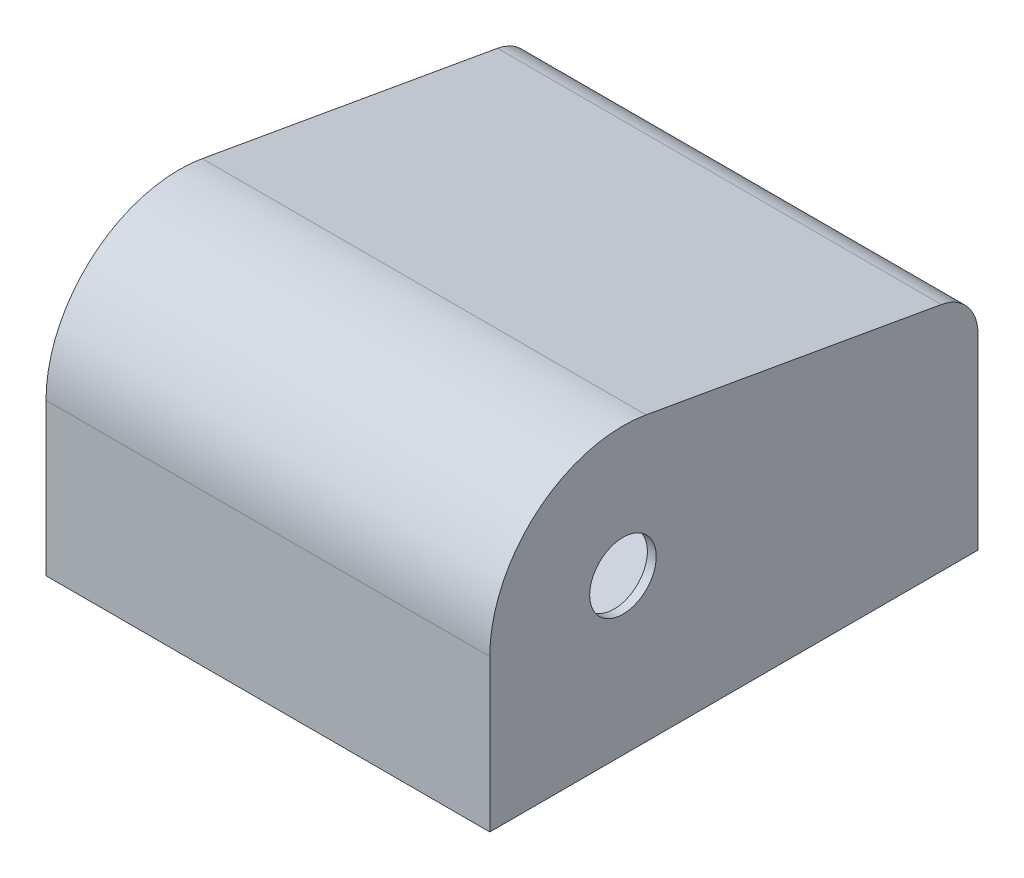
ISO-10303-21;
HEADER;
FILE_DESCRIPTION(('STEP AP214'),'2;1');
FILE_NAME('part.step','',(''),(''),'','','');
FILE_SCHEMA(('AUTOMOTIVE_DESIGN { 1 0 10303 214 1 1 1 1 }'));
ENDSEC;
DATA;
#1=APPLICATION_CONTEXT('core data for automotive mechanical design processes');
#2=APPLICATION_PROTOCOL_DEFINITION('international standard','automotive_design',2000,#1);
#3=PRODUCT_CONTEXT('',#1,'mechanical');
#4=PRODUCT('Part','Part','',(#3));
#5=PRODUCT_RELATED_PRODUCT_CATEGORY('part','',(#4));
#6=PRODUCT_DEFINITION_FORMATION('','',#4);
#7=PRODUCT_DEFINITION_CONTEXT('part definition',#1,'design');
#8=PRODUCT_DEFINITION('design','',#6,#7);
#9=PRODUCT_DEFINITION_SHAPE('','',#8);
#10=(LENGTH_UNIT() NAMED_UNIT(*) SI_UNIT(.MILLI.,.METRE.));
#11=(NAMED_UNIT(*) PLANE_ANGLE_UNIT() SI_UNIT($,.RADIAN.));
#12=(NAMED_UNIT(*) SI_UNIT($,.STERADIAN.) SOLID_ANGLE_UNIT());
#13=UNCERTAINTY_MEASURE_WITH_UNIT(LENGTH_MEASURE(1.E-05),#10,'distance_accuracy_value','');
#14=(GEOMETRIC_REPRESENTATION_CONTEXT(3) GLOBAL_UNCERTAINTY_ASSIGNED_CONTEXT((#13)) GLOBAL_UNIT_ASSIGNED_CONTEXT((#10,
#11,#12)) REPRESENTATION_CONTEXT('',''));
#15=CARTESIAN_POINT('',(0.,0.,0.));
#16=DIRECTION('',(0.,0.,1.));
#17=DIRECTION('',(1.,0.,0.));
#18=AXIS2_PLACEMENT_3D('',#15,#16,#17);
#19=CARTESIAN_POINT('',(980.,0.,0.));
#20=DIRECTION('',(-1.,0.,0.));
#21=DIRECTION('',(0.,0.,1.));
#22=AXIS2_PLACEMENT_3D('',#19,#20,#21);
#23=PLANE('',#22);
#24=DIRECTION('',(0.,1.,0.));
#25=VECTOR('',#24,1.);
#26=CARTESIAN_POINT('',(980.,0.,-1080.));
#27=LINE('',#26,#25);
#28=CARTESIAN_POINT('',(980.,20.,-1080.));
#29=VERTEX_POINT('',#28);
#30=CARTESIAN_POINT('',(980.,422.13035810296,-1080.));
#31=VERTEX_POINT('',#30);
#32=EDGE_CURVE('E197',#29,#31,#27,.T.);
#33=ORIENTED_EDGE('',*,*,#32,.F.);
#34=DIRECTION('',(0.,0.,-1.));
#35=VECTOR('',#34,1.);
#36=CARTESIAN_POINT('',(980.,20.,0.));
#37=LINE('',#36,#35);
#38=CARTESIAN_POINT('',(980.,20.,-20.));
#39=VERTEX_POINT('',#38);
#40=EDGE_CURVE('E187',#39,#29,#37,.T.);
#41=ORIENTED_EDGE('',*,*,#40,.F.);
#42=DIRECTION('',(0.,-1.,0.));
#43=VECTOR('',#42,1.);
#44=CARTESIAN_POINT('',(980.,0.,-20.));
#45=LINE('',#44,#43);
#46=CARTESIAN_POINT('',(980.,342.473922221737,-20.));
#47=VERTEX_POINT('',#46);
#48=EDGE_CURVE('E189',#47,#39,#45,.T.);
#49=ORIENTED_EDGE('',*,*,#48,.F.);
#50=CARTESIAN_POINT('',(980.,342.473922221737,-300.));
#51=DIRECTION('',(-1.,0.,0.));
#52=DIRECTION('',(0.,0.,1.));
#53=AXIS2_PLACEMENT_3D('',#50,#51,#52);
#54=CIRCLE('',#53,280.);
#55=CARTESIAN_POINT('',(980.,618.220093065155,-348.621489746741));
#56=VERTEX_POINT('',#55);
#57=EDGE_CURVE('E191',#56,#47,#54,.F.);
#58=ORIENTED_EDGE('',*,*,#57,.F.);
#59=DIRECTION('',(0.,-0.173648177666931,-0.984807753012208));
#60=VECTOR('',#59,1.);
#61=CARTESIAN_POINT('',(980.,659.196262214824,-116.234086610646));
#62=LINE('',#61,#60);
#63=CARTESIAN_POINT('',(980.,500.914978343937,-1013.89185421335));
#64=VERTEX_POINT('',#63);
#65=EDGE_CURVE('E193',#64,#56,#62,.F.);
#66=ORIENTED_EDGE('',*,*,#65,.F.);
#67=CARTESIAN_POINT('',(980.,422.13035810296,-1000.));
#68=DIRECTION('',(-1.,0.,0.));
#69=DIRECTION('',(0.,0.,1.));
#70=AXIS2_PLACEMENT_3D('',#67,#68,#69);
#71=CIRCLE('',#70,80.);
#72=EDGE_CURVE('E195',#31,#64,#71,.F.);
#73=ORIENTED_EDGE('',*,*,#72,.F.);
#74=EDGE_LOOP('',(#33,#41,#49,#58,#66,#73));
#75=FACE_BOUND('',#74,.T.);
#76=CARTESIAN_POINT('',(980.,350.,-300.));
#77=DIRECTION('',(-1.,0.,0.));
#78=DIRECTION('',(0.,0.,1.));
#79=AXIS2_PLACEMENT_3D('',#76,#77,#78);
#80=CIRCLE('',#79,75.);
#81=CARTESIAN_POINT('',(980.,350.,-225.));
#82=VERTEX_POINT('',#81);
#83=EDGE_CURVE('E244',#82,#82,#80,.F.);
#84=ORIENTED_EDGE('',*,*,#83,.T.);
#85=EDGE_LOOP('',(#84));
#86=FACE_BOUND('',#85,.T.);
#87=ADVANCED_FACE('F35',(#75,#86),#23,.T.);
#88=CARTESIAN_POINT('',(20.,0.,0.));
#89=DIRECTION('',(-1.,0.,0.));
#90=DIRECTION('',(0.,0.,1.));
#91=AXIS2_PLACEMENT_3D('',#88,#89,#90);
#92=PLANE('',#91);
#93=DIRECTION('',(0.,-0.173648177666931,-0.984807753012208));
#94=VECTOR('',#93,1.);
#95=CARTESIAN_POINT('',(20.,659.196262214824,-116.234086610646));
#96=LINE('',#95,#94);
#97=CARTESIAN_POINT('',(20.,500.914978343937,-1013.89185421335));
#98=VERTEX_POINT('',#97);
#99=CARTESIAN_POINT('',(20.,618.220093065155,-348.621489746741));
#100=VERTEX_POINT('',#99);
#101=EDGE_CURVE('E203',#98,#100,#96,.F.);
#102=ORIENTED_EDGE('',*,*,#101,.T.);
#103=CARTESIAN_POINT('',(20.,342.473922221737,-300.));
#104=DIRECTION('',(-1.,0.,0.));
#105=DIRECTION('',(0.,0.,1.));
#106=AXIS2_PLACEMENT_3D('',#103,#104,#105);
#107=CIRCLE('',#106,280.);
#108=CARTESIAN_POINT('',(20.,342.473922221737,-20.));
#109=VERTEX_POINT('',#108);
#110=EDGE_CURVE('E11',#109,#100,#107,.T.);
#111=ORIENTED_EDGE('',*,*,#110,.F.);
#112=DIRECTION('',(0.,-1.,0.));
#113=VECTOR('',#112,1.);
#114=CARTESIAN_POINT('',(20.,0.,-20.));
#115=LINE('',#114,#113);
#116=CARTESIAN_POINT('',(20.,20.,-20.));
#117=VERTEX_POINT('',#116);
#118=EDGE_CURVE('E89',#109,#117,#115,.T.);
#119=ORIENTED_EDGE('',*,*,#118,.T.);
#120=DIRECTION('',(0.,0.,-1.));
#121=VECTOR('',#120,1.);
#122=CARTESIAN_POINT('',(20.,20.,0.));
#123=LINE('',#122,#121);
#124=CARTESIAN_POINT('',(20.,20.,-1080.));
#125=VERTEX_POINT('',#124);
#126=EDGE_CURVE('E86',#117,#125,#123,.T.);
#127=ORIENTED_EDGE('',*,*,#126,.T.);
#128=DIRECTION('',(0.,1.,0.));
#129=VECTOR('',#128,1.);
#130=CARTESIAN_POINT('',(20.,0.,-1080.));
#131=LINE('',#130,#129);
#132=CARTESIAN_POINT('',(20.,422.13035810296,-1080.));
#133=VERTEX_POINT('',#132);
#134=EDGE_CURVE('E211',#125,#133,#131,.T.);
#135=ORIENTED_EDGE('',*,*,#134,.T.);
#136=CARTESIAN_POINT('',(20.,422.13035810296,-1000.));
#137=DIRECTION('',(-1.,0.,0.));
#138=DIRECTION('',(0.,0.,1.));
#139=AXIS2_PLACEMENT_3D('',#136,#137,#138);
#140=CIRCLE('',#139,80.);
#141=EDGE_CURVE('E45',#98,#133,#140,.T.);
#142=ORIENTED_EDGE('',*,*,#141,.F.);
#143=EDGE_LOOP('',(#102,#111,#119,#127,#135,#142));
#144=FACE_BOUND('',#143,.T.);
#145=CARTESIAN_POINT('',(20.,350.,-300.));
#146=DIRECTION('',(-1.,0.,0.));
#147=DIRECTION('',(0.,0.,1.));
#148=AXIS2_PLACEMENT_3D('',#145,#146,#147);
#149=CIRCLE('',#148,75.);
#150=CARTESIAN_POINT('',(20.,350.,-225.));
#151=VERTEX_POINT('',#150);
#152=EDGE_CURVE('E39',#151,#151,#149,.F.);
#153=ORIENTED_EDGE('',*,*,#152,.F.);
#154=EDGE_LOOP('',(#153));
#155=FACE_BOUND('',#154,.T.);
#156=ADVANCED_FACE('F236',(#144,#155),#92,.F.);
#157=CARTESIAN_POINT('',(1000.,0.,-20.));
#158=DIRECTION('',(0.,0.,-1.));
#159=DIRECTION('',(-1.,0.,0.));
#160=AXIS2_PLACEMENT_3D('',#157,#158,#159);
#161=PLANE('',#160);
#162=ORIENTED_EDGE('',*,*,#48,.T.);
#163=DIRECTION('',(-1.,0.,0.));
#164=VECTOR('',#163,1.);
#165=CARTESIAN_POINT('',(1000.,20.,-20.));
#166=LINE('',#165,#164);
#167=EDGE_CURVE('E213',#39,#117,#166,.T.);
#168=ORIENTED_EDGE('',*,*,#167,.T.);
#169=ORIENTED_EDGE('',*,*,#118,.F.);
#170=DIRECTION('',(-1.,0.,0.));
#171=VECTOR('',#170,1.);
#172=CARTESIAN_POINT('',(1000.,342.473922221737,-20.));
#173=LINE('',#172,#171);
#174=EDGE_CURVE('E184',#47,#109,#173,.T.);
#175=ORIENTED_EDGE('',*,*,#174,.F.);
#176=EDGE_LOOP('',(#162,#168,#169,#175));
#177=FACE_BOUND('',#176,.T.);
#178=ADVANCED_FACE('F225',(#177),#161,.T.);
#179=CARTESIAN_POINT('',(1000.,20.,0.));
#180=DIRECTION('',(0.,1.,0.));
#181=DIRECTION('',(0.,0.,1.));
#182=AXIS2_PLACEMENT_3D('',#179,#180,#181);
#183=PLANE('',#182);
#184=ORIENTED_EDGE('',*,*,#126,.F.);
#185=ORIENTED_EDGE('',*,*,#167,.F.);
#186=ORIENTED_EDGE('',*,*,#40,.T.);
#187=DIRECTION('',(-1.,0.,0.));
#188=VECTOR('',#187,1.);
#189=CARTESIAN_POINT('',(1000.,20.,-1080.));
#190=LINE('',#189,#188);
#191=EDGE_CURVE('E207',#29,#125,#190,.T.);
#192=ORIENTED_EDGE('',*,*,#191,.T.);
#193=EDGE_LOOP('',(#184,#185,#186,#192));
#194=FACE_BOUND('',#193,.T.);
#195=ADVANCED_FACE('F229',(#194),#183,.T.);
#196=CARTESIAN_POINT('',(1000.,0.,-1080.));
#197=DIRECTION('',(0.,0.,1.));
#198=DIRECTION('',(1.,0.,0.));
#199=AXIS2_PLACEMENT_3D('',#196,#197,#198);
#200=PLANE('',#199);
#201=ORIENTED_EDGE('',*,*,#134,.F.);
#202=ORIENTED_EDGE('',*,*,#191,.F.);
#203=ORIENTED_EDGE('',*,*,#32,.T.);
#204=DIRECTION('',(1.,0.,0.));
#205=VECTOR('',#204,1.);
#206=CARTESIAN_POINT('',(1000.,422.13035810296,-1080.));
#207=LINE('',#206,#205);
#208=EDGE_CURVE('E209',#133,#31,#207,.T.);
#209=ORIENTED_EDGE('',*,*,#208,.F.);
#210=EDGE_LOOP('',(#201,#202,#203,#209));
#211=FACE_BOUND('',#210,.T.);
#212=ADVANCED_FACE('F235',(#211),#200,.T.);
#213=CARTESIAN_POINT('',(1000.,680.303844939756,3.47296355333861));
#214=DIRECTION('',(0.,0.984807753012208,-0.173648177666931));
#215=DIRECTION('',(0.,0.173648177666931,0.984807753012208));
#216=AXIS2_PLACEMENT_3D('',#213,#214,#215);
#217=PLANE('',#216);
#218=ORIENTED_EDGE('',*,*,#65,.T.);
#219=DIRECTION('',(1.,0.,0.));
#220=VECTOR('',#219,1.);
#221=CARTESIAN_POINT('',(1000.,618.220093065155,-348.621489746741));
#222=LINE('',#221,#220);
#223=EDGE_CURVE('E200',#100,#56,#222,.T.);
#224=ORIENTED_EDGE('',*,*,#223,.F.);
#225=ORIENTED_EDGE('',*,*,#101,.F.);
#226=DIRECTION('',(1.,0.,0.));
#227=VECTOR('',#226,1.);
#228=CARTESIAN_POINT('',(1000.,500.914978343937,-1013.89185421335));
#229=LINE('',#228,#227);
#230=EDGE_CURVE('E205',#64,#98,#229,.F.);
#231=ORIENTED_EDGE('',*,*,#230,.F.);
#232=EDGE_LOOP('',(#218,#224,#225,#231));
#233=FACE_BOUND('',#232,.T.);
#234=ADVANCED_FACE('F294',(#233),#217,.F.);
#235=CARTESIAN_POINT('',(1000.,342.473922221737,-300.));
#236=DIRECTION('',(1.,0.,0.));
#237=DIRECTION('',(0.,0.,-1.));
#238=AXIS2_PLACEMENT_3D('',#235,#236,#237);
#239=CYLINDRICAL_SURFACE('',#238,280.);
#240=ORIENTED_EDGE('',*,*,#57,.T.);
#241=ORIENTED_EDGE('',*,*,#174,.T.);
#242=ORIENTED_EDGE('',*,*,#110,.T.);
#243=ORIENTED_EDGE('',*,*,#223,.T.);
#244=EDGE_LOOP('',(#240,#241,#242,#243));
#245=FACE_BOUND('',#244,.T.);
#246=ADVANCED_FACE('F220',(#245),#239,.F.);
#247=CARTESIAN_POINT('',(1000.,422.13035810296,-1000.));
#248=DIRECTION('',(1.,0.,0.));
#249=DIRECTION('',(0.,0.,-1.));
#250=AXIS2_PLACEMENT_3D('',#247,#248,#249);
#251=CYLINDRICAL_SURFACE('',#250,80.);
#252=ORIENTED_EDGE('',*,*,#72,.T.);
#253=ORIENTED_EDGE('',*,*,#230,.T.);
#254=ORIENTED_EDGE('',*,*,#141,.T.);
#255=ORIENTED_EDGE('',*,*,#208,.T.);
#256=EDGE_LOOP('',(#252,#253,#254,#255));
#257=FACE_BOUND('',#256,.T.);
#258=ADVANCED_FACE('F37',(#257),#251,.F.);
#259=CARTESIAN_POINT('',(1000.,350.,-300.));
#260=DIRECTION('',(-1.,0.,0.));
#261=DIRECTION('',(0.,0.,1.));
#262=AXIS2_PLACEMENT_3D('',#259,#260,#261);
#263=CYLINDRICAL_SURFACE('',#262,75.);
#264=CARTESIAN_POINT('',(0.,350.,-300.));
#265=DIRECTION('',(1.,0.,0.));
#266=DIRECTION('',(0.,0.,-1.));
#267=AXIS2_PLACEMENT_3D('',#264,#265,#266);
#268=CIRCLE('',#267,75.);
#269=CARTESIAN_POINT('',(0.,350.,-375.));
#270=VERTEX_POINT('',#269);
#271=EDGE_CURVE('E249',#270,#270,#268,.T.);
#272=ORIENTED_EDGE('',*,*,#271,.F.);
#273=EDGE_LOOP('',(#272));
#274=FACE_BOUND('',#273,.T.);
#275=ORIENTED_EDGE('',*,*,#152,.T.);
#276=EDGE_LOOP('',(#275));
#277=FACE_BOUND('',#276,.T.);
#278=ADVANCED_FACE('F276',(#274,#277),#263,.F.);
#279=ORIENTED_EDGE('',*,*,#83,.F.);
#280=EDGE_LOOP('',(#279));
#281=FACE_BOUND('',#280,.T.);
#282=CARTESIAN_POINT('',(1000.,350.,-300.));
#283=DIRECTION('',(1.,0.,0.));
#284=DIRECTION('',(0.,0.,-1.));
#285=AXIS2_PLACEMENT_3D('',#282,#283,#284);
#286=CIRCLE('',#285,75.);
#287=CARTESIAN_POINT('',(1000.,350.,-375.));
#288=VERTEX_POINT('',#287);
#289=EDGE_CURVE('E245',#288,#288,#286,.T.);
#290=ORIENTED_EDGE('',*,*,#289,.T.);
#291=EDGE_LOOP('',(#290));
#292=FACE_BOUND('',#291,.T.);
#293=ADVANCED_FACE('F278',(#281,#292),#263,.F.);
#294=CARTESIAN_POINT('',(1000.,0.,0.));
#295=DIRECTION('',(-1.,0.,0.));
#296=DIRECTION('',(0.,0.,1.));
#297=AXIS2_PLACEMENT_3D('',#294,#295,#296);
#298=PLANE('',#297);
#299=DIRECTION('',(0.,1.,0.));
#300=VECTOR('',#299,1.);
#301=CARTESIAN_POINT('',(1000.,0.,-1100.));
#302=LINE('',#301,#300);
#303=CARTESIAN_POINT('',(1000.,0.,-1100.));
#304=VERTEX_POINT('',#303);
#305=CARTESIAN_POINT('',(1000.,422.13035810296,-1100.));
#306=VERTEX_POINT('',#305);
#307=EDGE_CURVE('E155',#304,#306,#302,.T.);
#308=ORIENTED_EDGE('',*,*,#307,.T.);
#309=CARTESIAN_POINT('',(1000.,422.13035810296,-1000.));
#310=DIRECTION('',(-1.,0.,0.));
#311=DIRECTION('',(0.,0.,1.));
#312=AXIS2_PLACEMENT_3D('',#309,#310,#311);
#313=CIRCLE('',#312,100.);
#314=CARTESIAN_POINT('',(1000.,520.611133404181,-1017.36481776669));
#315=VERTEX_POINT('',#314);
#316=EDGE_CURVE('E183',#306,#315,#313,.F.);
#317=ORIENTED_EDGE('',*,*,#316,.T.);
#318=DIRECTION('',(0.,-0.173648177666931,-0.984807753012208));
#319=VECTOR('',#318,1.);
#320=CARTESIAN_POINT('',(1000.,678.892417275068,-119.707050163984));
#321=LINE('',#320,#319);
#322=CARTESIAN_POINT('',(1000.,637.916248125399,-352.094453300079));
#323=VERTEX_POINT('',#322);
#324=EDGE_CURVE('E165',#315,#323,#321,.F.);
#325=ORIENTED_EDGE('',*,*,#324,.T.);
#326=CARTESIAN_POINT('',(1000.,342.473922221737,-300.));
#327=DIRECTION('',(-1.,0.,0.));
#328=DIRECTION('',(0.,0.,1.));
#329=AXIS2_PLACEMENT_3D('',#326,#327,#328);
#330=CIRCLE('',#329,300.);
#331=CARTESIAN_POINT('',(1000.,342.473922221737,0.));
#332=VERTEX_POINT('',#331);
#333=EDGE_CURVE('E142',#323,#332,#330,.F.);
#334=ORIENTED_EDGE('',*,*,#333,.T.);
#335=DIRECTION('',(0.,-1.,0.));
#336=VECTOR('',#335,1.);
#337=CARTESIAN_POINT('',(1000.,0.,0.));
#338=LINE('',#337,#336);
#339=CARTESIAN_POINT('',(1000.,0.,0.));
#340=VERTEX_POINT('',#339);
#341=EDGE_CURVE('E135',#332,#340,#338,.T.);
#342=ORIENTED_EDGE('',*,*,#341,.T.);
#343=DIRECTION('',(0.,0.,-1.));
#344=VECTOR('',#343,1.);
#345=CARTESIAN_POINT('',(1000.,0.,0.));
#346=LINE('',#345,#344);
#347=EDGE_CURVE('E139',#340,#304,#346,.T.);
#348=ORIENTED_EDGE('',*,*,#347,.T.);
#349=EDGE_LOOP('',(#308,#317,#325,#334,#342,#348));
#350=FACE_BOUND('',#349,.T.);
#351=ORIENTED_EDGE('',*,*,#289,.F.);
#352=EDGE_LOOP('',(#351));
#353=FACE_BOUND('',#352,.T.);
#354=ADVANCED_FACE('F137',(#350,#353),#298,.F.);
#355=CARTESIAN_POINT('',(0.,0.,0.));
#356=DIRECTION('',(-1.,0.,0.));
#357=DIRECTION('',(0.,0.,1.));
#358=AXIS2_PLACEMENT_3D('',#355,#356,#357);
#359=PLANE('',#358);
#360=DIRECTION('',(0.,-0.173648177666931,-0.984807753012208));
#361=VECTOR('',#360,1.);
#362=CARTESIAN_POINT('',(0.,678.892417275068,-119.707050163984));
#363=LINE('',#362,#361);
#364=CARTESIAN_POINT('',(0.,520.611133404181,-1017.36481776669));
#365=VERTEX_POINT('',#364);
#366=CARTESIAN_POINT('',(0.,637.916248125399,-352.094453300079));
#367=VERTEX_POINT('',#366);
#368=EDGE_CURVE('E147',#365,#367,#363,.F.);
#369=ORIENTED_EDGE('',*,*,#368,.F.);
#370=CARTESIAN_POINT('',(0.,422.13035810296,-1000.));
#371=DIRECTION('',(-1.,0.,0.));
#372=DIRECTION('',(0.,0.,1.));
#373=AXIS2_PLACEMENT_3D('',#370,#371,#372);
#374=CIRCLE('',#373,100.);
#375=CARTESIAN_POINT('',(0.,422.13035810296,-1100.));
#376=VERTEX_POINT('',#375);
#377=EDGE_CURVE('E104',#365,#376,#374,.T.);
#378=ORIENTED_EDGE('',*,*,#377,.T.);
#379=DIRECTION('',(0.,1.,0.));
#380=VECTOR('',#379,1.);
#381=CARTESIAN_POINT('',(0.,0.,-1100.));
#382=LINE('',#381,#380);
#383=CARTESIAN_POINT('',(0.,0.,-1100.));
#384=VERTEX_POINT('',#383);
#385=EDGE_CURVE('E170',#384,#376,#382,.T.);
#386=ORIENTED_EDGE('',*,*,#385,.F.);
#387=DIRECTION('',(0.,0.,-1.));
#388=VECTOR('',#387,1.);
#389=CARTESIAN_POINT('',(0.,0.,0.));
#390=LINE('',#389,#388);
#391=CARTESIAN_POINT('',(0.,0.,0.));
#392=VERTEX_POINT('',#391);
#393=EDGE_CURVE('E258',#392,#384,#390,.T.);
#394=ORIENTED_EDGE('',*,*,#393,.F.);
#395=DIRECTION('',(0.,-1.,0.));
#396=VECTOR('',#395,1.);
#397=CARTESIAN_POINT('',(0.,0.,0.));
#398=LINE('',#397,#396);
#399=CARTESIAN_POINT('',(0.,342.473922221737,0.));
#400=VERTEX_POINT('',#399);
#401=EDGE_CURVE('E159',#400,#392,#398,.T.);
#402=ORIENTED_EDGE('',*,*,#401,.F.);
#403=CARTESIAN_POINT('',(0.,342.473922221737,-300.));
#404=DIRECTION('',(-1.,0.,0.));
#405=DIRECTION('',(0.,0.,1.));
#406=AXIS2_PLACEMENT_3D('',#403,#404,#405);
#407=CIRCLE('',#406,300.);
#408=EDGE_CURVE('E163',#400,#367,#407,.T.);
#409=ORIENTED_EDGE('',*,*,#408,.T.);
#410=EDGE_LOOP('',(#369,#378,#386,#394,#402,#409));
#411=FACE_BOUND('',#410,.T.);
#412=ORIENTED_EDGE('',*,*,#271,.T.);
#413=EDGE_LOOP('',(#412));
#414=FACE_BOUND('',#413,.T.);
#415=ADVANCED_FACE('F270',(#411,#414),#359,.T.);
#416=CARTESIAN_POINT('',(1000.,0.,0.));
#417=DIRECTION('',(0.,0.,-1.));
#418=DIRECTION('',(-1.,0.,0.));
#419=AXIS2_PLACEMENT_3D('',#416,#417,#418);
#420=PLANE('',#419);
#421=ORIENTED_EDGE('',*,*,#341,.F.);
#422=DIRECTION('',(1.,0.,0.));
#423=VECTOR('',#422,1.);
#424=CARTESIAN_POINT('',(1000.,342.473922221737,0.));
#425=LINE('',#424,#423);
#426=EDGE_CURVE('E161',#332,#400,#425,.F.);
#427=ORIENTED_EDGE('',*,*,#426,.T.);
#428=ORIENTED_EDGE('',*,*,#401,.T.);
#429=DIRECTION('',(-1.,0.,0.));
#430=VECTOR('',#429,1.);
#431=CARTESIAN_POINT('',(1000.,0.,0.));
#432=LINE('',#431,#430);
#433=EDGE_CURVE('E152',#340,#392,#432,.T.);
#434=ORIENTED_EDGE('',*,*,#433,.F.);
#435=EDGE_LOOP('',(#421,#427,#428,#434));
#436=FACE_BOUND('',#435,.T.);
#437=ADVANCED_FACE('F157',(#436),#420,.F.);
#438=CARTESIAN_POINT('',(1000.,0.,0.));
#439=DIRECTION('',(0.,1.,0.));
#440=DIRECTION('',(0.,0.,1.));
#441=AXIS2_PLACEMENT_3D('',#438,#439,#440);
#442=PLANE('',#441);
#443=ORIENTED_EDGE('',*,*,#393,.T.);
#444=DIRECTION('',(-1.,0.,0.));
#445=VECTOR('',#444,1.);
#446=CARTESIAN_POINT('',(1000.,0.,-1100.));
#447=LINE('',#446,#445);
#448=EDGE_CURVE('E154',#304,#384,#447,.T.);
#449=ORIENTED_EDGE('',*,*,#448,.F.);
#450=ORIENTED_EDGE('',*,*,#347,.F.);
#451=ORIENTED_EDGE('',*,*,#433,.T.);
#452=EDGE_LOOP('',(#443,#449,#450,#451));
#453=FACE_BOUND('',#452,.T.);
#454=ADVANCED_FACE('F151',(#453),#442,.F.);
#455=CARTESIAN_POINT('',(1000.,0.,-1100.));
#456=DIRECTION('',(0.,0.,1.));
#457=DIRECTION('',(1.,0.,0.));
#458=AXIS2_PLACEMENT_3D('',#455,#456,#457);
#459=PLANE('',#458);
#460=ORIENTED_EDGE('',*,*,#385,.T.);
#461=DIRECTION('',(1.,0.,0.));
#462=VECTOR('',#461,1.);
#463=CARTESIAN_POINT('',(1000.,422.13035810296,-1100.));
#464=LINE('',#463,#462);
#465=EDGE_CURVE('E96',#376,#306,#464,.T.);
#466=ORIENTED_EDGE('',*,*,#465,.T.);
#467=ORIENTED_EDGE('',*,*,#307,.F.);
#468=ORIENTED_EDGE('',*,*,#448,.T.);
#469=EDGE_LOOP('',(#460,#466,#467,#468));
#470=FACE_BOUND('',#469,.T.);
#471=ADVANCED_FACE('F259',(#470),#459,.F.);
#472=CARTESIAN_POINT('',(1000.,700.,0.));
#473=DIRECTION('',(0.,0.984807753012208,-0.173648177666931));
#474=DIRECTION('',(0.,0.173648177666931,0.984807753012208));
#475=AXIS2_PLACEMENT_3D('',#472,#473,#474);
#476=PLANE('',#475);
#477=ORIENTED_EDGE('',*,*,#324,.F.);
#478=DIRECTION('',(-1.,0.,0.));
#479=VECTOR('',#478,1.);
#480=CARTESIAN_POINT('',(1000.,520.611133404181,-1017.36481776669));
#481=LINE('',#480,#479);
#482=EDGE_CURVE('E178',#315,#365,#481,.T.);
#483=ORIENTED_EDGE('',*,*,#482,.T.);
#484=ORIENTED_EDGE('',*,*,#368,.T.);
#485=DIRECTION('',(-1.,0.,0.));
#486=VECTOR('',#485,1.);
#487=CARTESIAN_POINT('',(1000.,637.916248125399,-352.094453300079));
#488=LINE('',#487,#486);
#489=EDGE_CURVE('E174',#367,#323,#488,.F.);
#490=ORIENTED_EDGE('',*,*,#489,.T.);
#491=EDGE_LOOP('',(#477,#483,#484,#490));
#492=FACE_BOUND('',#491,.T.);
#493=ADVANCED_FACE('F266',(#492),#476,.T.);
#494=CARTESIAN_POINT('',(1000.,342.473922221737,-300.));
#495=DIRECTION('',(1.,0.,0.));
#496=DIRECTION('',(0.,0.,-1.));
#497=AXIS2_PLACEMENT_3D('',#494,#495,#496);
#498=CYLINDRICAL_SURFACE('',#497,300.);
#499=ORIENTED_EDGE('',*,*,#333,.F.);
#500=ORIENTED_EDGE('',*,*,#489,.F.);
#501=ORIENTED_EDGE('',*,*,#408,.F.);
#502=ORIENTED_EDGE('',*,*,#426,.F.);
#503=EDGE_LOOP('',(#499,#500,#501,#502));
#504=FACE_BOUND('',#503,.T.);
#505=ADVANCED_FACE('F269',(#504),#498,.T.);
#506=CARTESIAN_POINT('',(1000.,422.13035810296,-1000.));
#507=DIRECTION('',(1.,0.,0.));
#508=DIRECTION('',(0.,0.,-1.));
#509=AXIS2_PLACEMENT_3D('',#506,#507,#508);
#510=CYLINDRICAL_SURFACE('',#509,100.);
#511=ORIENTED_EDGE('',*,*,#316,.F.);
#512=ORIENTED_EDGE('',*,*,#465,.F.);
#513=ORIENTED_EDGE('',*,*,#377,.F.);
#514=ORIENTED_EDGE('',*,*,#482,.F.);
#515=EDGE_LOOP('',(#511,#512,#513,#514));
#516=FACE_BOUND('',#515,.T.);
#517=ADVANCED_FACE('F262',(#516),#510,.T.);
#518=CLOSED_SHELL('',(#87,#156,#178,#195,#212,#234,#246,#258,#278,#293,#354,#415,#437,#454,#471,
#493,#505,#517));
#519=MANIFOLD_SOLID_BREP('B2',#518);
#520=ADVANCED_BREP_SHAPE_REPRESENTATION('',(#18,#519),#14);
#521=SHAPE_DEFINITION_REPRESENTATION(#9,#520);
ENDSEC;
END-ISO-10303-21;
